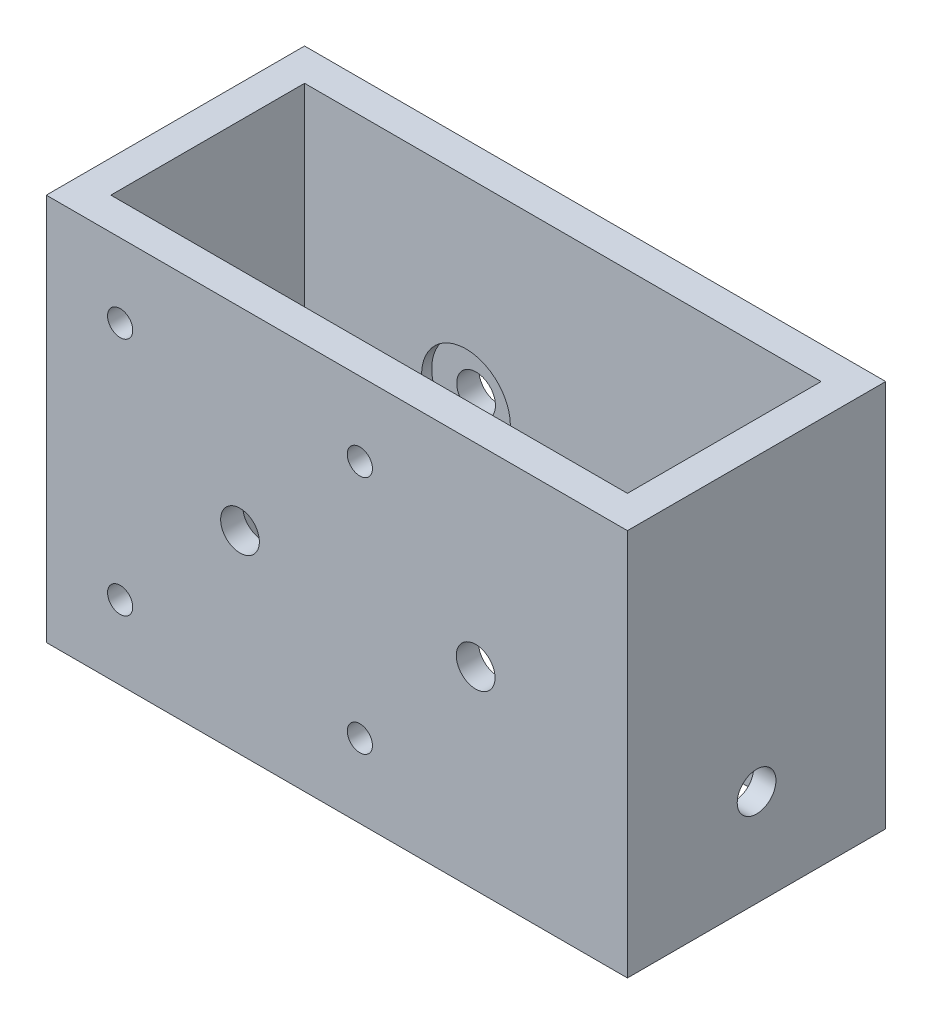
ISO-10303-21;
HEADER;
FILE_DESCRIPTION(('STEP AP214'),'2;1');
FILE_NAME('part.step','',(''),(''),'','','');
FILE_SCHEMA(('AUTOMOTIVE_DESIGN { 1 0 10303 214 1 1 1 1 }'));
ENDSEC;
DATA;
#1=APPLICATION_CONTEXT('core data for automotive mechanical design processes');
#2=APPLICATION_PROTOCOL_DEFINITION('international standard','automotive_design',2000,#1);
#3=PRODUCT_CONTEXT('',#1,'mechanical');
#4=PRODUCT('Part','Part','',(#3));
#5=PRODUCT_RELATED_PRODUCT_CATEGORY('part','',(#4));
#6=PRODUCT_DEFINITION_FORMATION('','',#4);
#7=PRODUCT_DEFINITION_CONTEXT('part definition',#1,'design');
#8=PRODUCT_DEFINITION('design','',#6,#7);
#9=PRODUCT_DEFINITION_SHAPE('','',#8);
#10=(LENGTH_UNIT() NAMED_UNIT(*) SI_UNIT(.MILLI.,.METRE.));
#11=(NAMED_UNIT(*) PLANE_ANGLE_UNIT() SI_UNIT($,.RADIAN.));
#12=(NAMED_UNIT(*) SI_UNIT($,.STERADIAN.) SOLID_ANGLE_UNIT());
#13=UNCERTAINTY_MEASURE_WITH_UNIT(LENGTH_MEASURE(1.E-05),#10,'distance_accuracy_value','');
#14=(GEOMETRIC_REPRESENTATION_CONTEXT(3) GLOBAL_UNCERTAINTY_ASSIGNED_CONTEXT((#13)) GLOBAL_UNIT_ASSIGNED_CONTEXT((#10,
#11,#12)) REPRESENTATION_CONTEXT('',''));
#15=CARTESIAN_POINT('',(0.,0.,0.));
#16=DIRECTION('',(0.,0.,1.));
#17=DIRECTION('',(1.,0.,0.));
#18=AXIS2_PLACEMENT_3D('',#15,#16,#17);
#19=CARTESIAN_POINT('',(38.1,38.1,0.));
#20=DIRECTION('',(0.,0.,1.));
#21=DIRECTION('',(1.,0.,0.));
#22=AXIS2_PLACEMENT_3D('',#19,#20,#21);
#23=CYLINDRICAL_SURFACE('',#22,3.81);
#24=CARTESIAN_POINT('',(38.1,38.1,0.));
#25=DIRECTION('',(0.,0.,1.));
#26=DIRECTION('',(1.,0.,0.));
#27=AXIS2_PLACEMENT_3D('',#24,#25,#26);
#28=CIRCLE('',#27,3.81);
#29=CARTESIAN_POINT('',(41.91,38.1,0.));
#30=VERTEX_POINT('',#29);
#31=EDGE_CURVE('E233',#30,#30,#28,.T.);
#32=ORIENTED_EDGE('',*,*,#31,.F.);
#33=EDGE_LOOP('',(#32));
#34=FACE_BOUND('',#33,.T.);
#35=CARTESIAN_POINT('',(38.1,38.1,4.365625));
#36=DIRECTION('',(0.,0.,1.));
#37=DIRECTION('',(1.,0.,0.));
#38=AXIS2_PLACEMENT_3D('',#35,#36,#37);
#39=CIRCLE('',#38,3.81);
#40=CARTESIAN_POINT('',(41.91,38.1,4.365625));
#41=VERTEX_POINT('',#40);
#42=EDGE_CURVE('E38',#41,#41,#39,.F.);
#43=ORIENTED_EDGE('',*,*,#42,.F.);
#44=EDGE_LOOP('',(#43));
#45=FACE_BOUND('',#44,.T.);
#46=ADVANCED_FACE('F34',(#34,#45),#23,.F.);
#47=CARTESIAN_POINT('',(84.455,38.1,0.));
#48=DIRECTION('',(0.,0.,1.));
#49=DIRECTION('',(1.,0.,0.));
#50=AXIS2_PLACEMENT_3D('',#47,#48,#49);
#51=CYLINDRICAL_SURFACE('',#50,3.81);
#52=CARTESIAN_POINT('',(84.455,38.1,0.));
#53=DIRECTION('',(0.,0.,1.));
#54=DIRECTION('',(1.,0.,0.));
#55=AXIS2_PLACEMENT_3D('',#52,#53,#54);
#56=CIRCLE('',#55,3.81);
#57=CARTESIAN_POINT('',(88.265,38.1,0.));
#58=VERTEX_POINT('',#57);
#59=EDGE_CURVE('E227',#58,#58,#56,.T.);
#60=ORIENTED_EDGE('',*,*,#59,.F.);
#61=EDGE_LOOP('',(#60));
#62=FACE_BOUND('',#61,.T.);
#63=CARTESIAN_POINT('',(84.455,38.1,4.365625));
#64=DIRECTION('',(0.,0.,1.));
#65=DIRECTION('',(1.,0.,0.));
#66=AXIS2_PLACEMENT_3D('',#63,#64,#65);
#67=CIRCLE('',#66,3.81);
#68=CARTESIAN_POINT('',(88.265,38.1,4.365625));
#69=VERTEX_POINT('',#68);
#70=EDGE_CURVE('E182',#69,#69,#67,.F.);
#71=ORIENTED_EDGE('',*,*,#70,.F.);
#72=EDGE_LOOP('',(#71));
#73=FACE_BOUND('',#72,.T.);
#74=ADVANCED_FACE('F300',(#62,#73),#51,.F.);
#75=CARTESIAN_POINT('',(114.3,19.05,25.4));
#76=DIRECTION('',(-1.,0.,0.));
#77=DIRECTION('',(0.,0.,1.));
#78=AXIS2_PLACEMENT_3D('',#75,#76,#77);
#79=CYLINDRICAL_SURFACE('',#78,3.81);
#80=CARTESIAN_POINT('',(114.3,19.05,25.4));
#81=DIRECTION('',(-1.,0.,0.));
#82=DIRECTION('',(0.,0.,1.));
#83=AXIS2_PLACEMENT_3D('',#80,#81,#82);
#84=CIRCLE('',#83,3.81);
#85=CARTESIAN_POINT('',(114.3,19.05,29.21));
#86=VERTEX_POINT('',#85);
#87=EDGE_CURVE('E221',#86,#86,#84,.T.);
#88=ORIENTED_EDGE('',*,*,#87,.F.);
#89=EDGE_LOOP('',(#88));
#90=FACE_BOUND('',#89,.T.);
#91=CARTESIAN_POINT('',(109.934375,19.05,25.4));
#92=DIRECTION('',(-1.,0.,0.));
#93=DIRECTION('',(0.,0.,1.));
#94=AXIS2_PLACEMENT_3D('',#91,#92,#93);
#95=CIRCLE('',#94,3.81);
#96=CARTESIAN_POINT('',(109.934375,19.05,29.21));
#97=VERTEX_POINT('',#96);
#98=EDGE_CURVE('E178',#97,#97,#95,.F.);
#99=ORIENTED_EDGE('',*,*,#98,.F.);
#100=EDGE_LOOP('',(#99));
#101=FACE_BOUND('',#100,.T.);
#102=ADVANCED_FACE('F297',(#90,#101),#79,.F.);
#103=CARTESIAN_POINT('',(38.1,38.1,50.8));
#104=DIRECTION('',(0.,0.,1.));
#105=DIRECTION('',(1.,0.,0.));
#106=AXIS2_PLACEMENT_3D('',#103,#104,#105);
#107=CIRCLE('',#106,3.81);
#108=CARTESIAN_POINT('',(41.91,38.1,50.8));
#109=VERTEX_POINT('',#108);
#110=EDGE_CURVE('E230',#109,#109,#107,.T.);
#111=ORIENTED_EDGE('',*,*,#110,.T.);
#112=EDGE_LOOP('',(#111));
#113=FACE_BOUND('',#112,.T.);
#114=CARTESIAN_POINT('',(38.1,38.1,46.434375));
#115=DIRECTION('',(0.,0.,-1.));
#116=DIRECTION('',(-1.,0.,0.));
#117=AXIS2_PLACEMENT_3D('',#114,#115,#116);
#118=CIRCLE('',#117,3.81);
#119=CARTESIAN_POINT('',(34.29,38.1,46.434375));
#120=VERTEX_POINT('',#119);
#121=EDGE_CURVE('E173',#120,#120,#118,.F.);
#122=ORIENTED_EDGE('',*,*,#121,.F.);
#123=EDGE_LOOP('',(#122));
#124=FACE_BOUND('',#123,.T.);
#125=ADVANCED_FACE('F303',(#113,#124),#23,.F.);
#126=CARTESIAN_POINT('',(84.455,38.1,50.8));
#127=DIRECTION('',(0.,0.,1.));
#128=DIRECTION('',(1.,0.,0.));
#129=AXIS2_PLACEMENT_3D('',#126,#127,#128);
#130=CIRCLE('',#129,3.81);
#131=CARTESIAN_POINT('',(88.265,38.1,50.8));
#132=VERTEX_POINT('',#131);
#133=EDGE_CURVE('E224',#132,#132,#130,.T.);
#134=ORIENTED_EDGE('',*,*,#133,.T.);
#135=EDGE_LOOP('',(#134));
#136=FACE_BOUND('',#135,.T.);
#137=CARTESIAN_POINT('',(84.455,38.1,46.434375));
#138=DIRECTION('',(0.,0.,-1.));
#139=DIRECTION('',(-1.,0.,0.));
#140=AXIS2_PLACEMENT_3D('',#137,#138,#139);
#141=CIRCLE('',#140,3.81);
#142=CARTESIAN_POINT('',(80.645,38.1,46.434375));
#143=VERTEX_POINT('',#142);
#144=EDGE_CURVE('E170',#143,#143,#141,.F.);
#145=ORIENTED_EDGE('',*,*,#144,.F.);
#146=EDGE_LOOP('',(#145));
#147=FACE_BOUND('',#146,.T.);
#148=ADVANCED_FACE('F294',(#136,#147),#51,.F.);
#149=CARTESIAN_POINT('',(0.,19.05,25.4));
#150=DIRECTION('',(-1.,0.,0.));
#151=DIRECTION('',(0.,0.,1.));
#152=AXIS2_PLACEMENT_3D('',#149,#150,#151);
#153=CIRCLE('',#152,3.81);
#154=CARTESIAN_POINT('',(0.,19.05,29.21));
#155=VERTEX_POINT('',#154);
#156=EDGE_CURVE('E168',#155,#155,#153,.T.);
#157=ORIENTED_EDGE('',*,*,#156,.T.);
#158=EDGE_LOOP('',(#157));
#159=FACE_BOUND('',#158,.T.);
#160=CARTESIAN_POINT('',(4.365625,19.05,25.4));
#161=DIRECTION('',(1.,0.,0.));
#162=DIRECTION('',(0.,0.,-1.));
#163=AXIS2_PLACEMENT_3D('',#160,#161,#162);
#164=CIRCLE('',#163,3.81);
#165=CARTESIAN_POINT('',(4.365625,19.05,21.59));
#166=VERTEX_POINT('',#165);
#167=EDGE_CURVE('E165',#166,#166,#164,.F.);
#168=ORIENTED_EDGE('',*,*,#167,.F.);
#169=EDGE_LOOP('',(#168));
#170=FACE_BOUND('',#169,.T.);
#171=ADVANCED_FACE('F287',(#159,#170),#79,.F.);
#172=CARTESIAN_POINT('',(0.,76.2,0.));
#173=DIRECTION('',(0.,1.,0.));
#174=DIRECTION('',(0.,0.,1.));
#175=AXIS2_PLACEMENT_3D('',#172,#173,#174);
#176=PLANE('',#175);
#177=DIRECTION('',(0.,0.,1.));
#178=VECTOR('',#177,1.);
#179=CARTESIAN_POINT('',(0.,76.2,0.));
#180=LINE('',#179,#178);
#181=CARTESIAN_POINT('',(0.,76.2,0.));
#182=VERTEX_POINT('',#181);
#183=CARTESIAN_POINT('',(0.,76.2,50.8));
#184=VERTEX_POINT('',#183);
#185=EDGE_CURVE('E140',#182,#184,#180,.T.);
#186=ORIENTED_EDGE('',*,*,#185,.T.);
#187=DIRECTION('',(1.,0.,0.));
#188=VECTOR('',#187,1.);
#189=CARTESIAN_POINT('',(0.,76.2,50.8));
#190=LINE('',#189,#188);
#191=CARTESIAN_POINT('',(114.3,76.2,50.8));
#192=VERTEX_POINT('',#191);
#193=EDGE_CURVE('E143',#184,#192,#190,.T.);
#194=ORIENTED_EDGE('',*,*,#193,.T.);
#195=DIRECTION('',(0.,0.,-1.));
#196=VECTOR('',#195,1.);
#197=CARTESIAN_POINT('',(114.3,76.2,0.));
#198=LINE('',#197,#196);
#199=CARTESIAN_POINT('',(114.3,76.2,0.));
#200=VERTEX_POINT('',#199);
#201=EDGE_CURVE('E146',#192,#200,#198,.T.);
#202=ORIENTED_EDGE('',*,*,#201,.T.);
#203=DIRECTION('',(-1.,0.,0.));
#204=VECTOR('',#203,1.);
#205=CARTESIAN_POINT('',(0.,76.2,0.));
#206=LINE('',#205,#204);
#207=EDGE_CURVE('E148',#200,#182,#206,.T.);
#208=ORIENTED_EDGE('',*,*,#207,.T.);
#209=EDGE_LOOP('',(#186,#194,#202,#208));
#210=FACE_BOUND('',#209,.T.);
#211=DIRECTION('',(1.,0.,0.));
#212=VECTOR('',#211,1.);
#213=CARTESIAN_POINT('',(107.95,76.2,44.45));
#214=LINE('',#213,#212);
#215=CARTESIAN_POINT('',(6.35,76.2,44.45));
#216=VERTEX_POINT('',#215);
#217=CARTESIAN_POINT('',(107.95,76.2,44.45));
#218=VERTEX_POINT('',#217);
#219=EDGE_CURVE('E109',#216,#218,#214,.T.);
#220=ORIENTED_EDGE('',*,*,#219,.F.);
#221=DIRECTION('',(0.,0.,1.));
#222=VECTOR('',#221,1.);
#223=CARTESIAN_POINT('',(6.35,76.2,44.45));
#224=LINE('',#223,#222);
#225=CARTESIAN_POINT('',(6.35,76.2,6.35));
#226=VERTEX_POINT('',#225);
#227=EDGE_CURVE('E101',#226,#216,#224,.T.);
#228=ORIENTED_EDGE('',*,*,#227,.F.);
#229=DIRECTION('',(-1.,0.,0.));
#230=VECTOR('',#229,1.);
#231=CARTESIAN_POINT('',(107.95,76.2,6.35));
#232=LINE('',#231,#230);
#233=CARTESIAN_POINT('',(107.95,76.2,6.35));
#234=VERTEX_POINT('',#233);
#235=EDGE_CURVE('E124',#234,#226,#232,.T.);
#236=ORIENTED_EDGE('',*,*,#235,.F.);
#237=DIRECTION('',(0.,0.,-1.));
#238=VECTOR('',#237,1.);
#239=CARTESIAN_POINT('',(107.95,76.2,44.45));
#240=LINE('',#239,#238);
#241=EDGE_CURVE('E122',#218,#234,#240,.T.);
#242=ORIENTED_EDGE('',*,*,#241,.F.);
#243=EDGE_LOOP('',(#220,#228,#236,#242));
#244=FACE_BOUND('',#243,.T.);
#245=ADVANCED_FACE('F121',(#210,#244),#176,.T.);
#246=CARTESIAN_POINT('',(0.,0.,0.));
#247=DIRECTION('',(0.,1.,0.));
#248=DIRECTION('',(0.,0.,1.));
#249=AXIS2_PLACEMENT_3D('',#246,#247,#248);
#250=PLANE('',#249);
#251=DIRECTION('',(0.,0.,1.));
#252=VECTOR('',#251,1.);
#253=CARTESIAN_POINT('',(0.,0.,0.));
#254=LINE('',#253,#252);
#255=CARTESIAN_POINT('',(0.,0.,0.));
#256=VERTEX_POINT('',#255);
#257=CARTESIAN_POINT('',(0.,0.,50.8));
#258=VERTEX_POINT('',#257);
#259=EDGE_CURVE('E117',#256,#258,#254,.T.);
#260=ORIENTED_EDGE('',*,*,#259,.F.);
#261=DIRECTION('',(-1.,0.,0.));
#262=VECTOR('',#261,1.);
#263=CARTESIAN_POINT('',(0.,0.,0.));
#264=LINE('',#263,#262);
#265=CARTESIAN_POINT('',(114.3,0.,0.));
#266=VERTEX_POINT('',#265);
#267=EDGE_CURVE('E144',#266,#256,#264,.T.);
#268=ORIENTED_EDGE('',*,*,#267,.F.);
#269=DIRECTION('',(0.,0.,-1.));
#270=VECTOR('',#269,1.);
#271=CARTESIAN_POINT('',(114.3,0.,0.));
#272=LINE('',#271,#270);
#273=CARTESIAN_POINT('',(114.3,0.,50.8));
#274=VERTEX_POINT('',#273);
#275=EDGE_CURVE('E155',#274,#266,#272,.T.);
#276=ORIENTED_EDGE('',*,*,#275,.F.);
#277=DIRECTION('',(1.,0.,0.));
#278=VECTOR('',#277,1.);
#279=CARTESIAN_POINT('',(0.,0.,50.8));
#280=LINE('',#279,#278);
#281=EDGE_CURVE('E153',#258,#274,#280,.T.);
#282=ORIENTED_EDGE('',*,*,#281,.F.);
#283=EDGE_LOOP('',(#260,#268,#276,#282));
#284=FACE_BOUND('',#283,.T.);
#285=DIRECTION('',(0.,0.,1.));
#286=VECTOR('',#285,1.);
#287=CARTESIAN_POINT('',(6.35,0.,44.45));
#288=LINE('',#287,#286);
#289=CARTESIAN_POINT('',(6.35,0.,6.35));
#290=VERTEX_POINT('',#289);
#291=CARTESIAN_POINT('',(6.35,0.,44.45));
#292=VERTEX_POINT('',#291);
#293=EDGE_CURVE('E59',#290,#292,#288,.T.);
#294=ORIENTED_EDGE('',*,*,#293,.T.);
#295=DIRECTION('',(1.,0.,0.));
#296=VECTOR('',#295,1.);
#297=CARTESIAN_POINT('',(107.95,0.,44.45));
#298=LINE('',#297,#296);
#299=CARTESIAN_POINT('',(107.95,0.,44.45));
#300=VERTEX_POINT('',#299);
#301=EDGE_CURVE('E116',#292,#300,#298,.T.);
#302=ORIENTED_EDGE('',*,*,#301,.T.);
#303=DIRECTION('',(0.,0.,-1.));
#304=VECTOR('',#303,1.);
#305=CARTESIAN_POINT('',(107.95,0.,44.45));
#306=LINE('',#305,#304);
#307=CARTESIAN_POINT('',(107.95,0.,6.35));
#308=VERTEX_POINT('',#307);
#309=EDGE_CURVE('E132',#300,#308,#306,.T.);
#310=ORIENTED_EDGE('',*,*,#309,.T.);
#311=DIRECTION('',(-1.,0.,0.));
#312=VECTOR('',#311,1.);
#313=CARTESIAN_POINT('',(107.95,0.,6.35));
#314=LINE('',#313,#312);
#315=EDGE_CURVE('E110',#308,#290,#314,.T.);
#316=ORIENTED_EDGE('',*,*,#315,.T.);
#317=EDGE_LOOP('',(#294,#302,#310,#316));
#318=FACE_BOUND('',#317,.T.);
#319=ADVANCED_FACE('F277',(#284,#318),#250,.F.);
#320=CARTESIAN_POINT('',(0.,76.2,0.));
#321=DIRECTION('',(1.,0.,0.));
#322=DIRECTION('',(0.,0.,-1.));
#323=AXIS2_PLACEMENT_3D('',#320,#321,#322);
#324=PLANE('',#323);
#325=ORIENTED_EDGE('',*,*,#156,.F.);
#326=EDGE_LOOP('',(#325));
#327=FACE_BOUND('',#326,.T.);
#328=ORIENTED_EDGE('',*,*,#259,.T.);
#329=DIRECTION('',(0.,-1.,0.));
#330=VECTOR('',#329,1.);
#331=CARTESIAN_POINT('',(0.,76.2,50.8));
#332=LINE('',#331,#330);
#333=EDGE_CURVE('E11',#184,#258,#332,.T.);
#334=ORIENTED_EDGE('',*,*,#333,.F.);
#335=ORIENTED_EDGE('',*,*,#185,.F.);
#336=DIRECTION('',(0.,-1.,0.));
#337=VECTOR('',#336,1.);
#338=CARTESIAN_POINT('',(0.,76.2,0.));
#339=LINE('',#338,#337);
#340=EDGE_CURVE('E150',#182,#256,#339,.T.);
#341=ORIENTED_EDGE('',*,*,#340,.T.);
#342=EDGE_LOOP('',(#328,#334,#335,#341));
#343=FACE_BOUND('',#342,.T.);
#344=ADVANCED_FACE('F36',(#327,#343),#324,.F.);
#345=CARTESIAN_POINT('',(0.,76.2,50.8));
#346=DIRECTION('',(0.,0.,-1.));
#347=DIRECTION('',(-1.,0.,0.));
#348=AXIS2_PLACEMENT_3D('',#345,#346,#347);
#349=PLANE('',#348);
#350=ORIENTED_EDGE('',*,*,#133,.F.);
#351=EDGE_LOOP('',(#350));
#352=FACE_BOUND('',#351,.T.);
#353=ORIENTED_EDGE('',*,*,#110,.F.);
#354=EDGE_LOOP('',(#353));
#355=FACE_BOUND('',#354,.T.);
#356=CARTESIAN_POINT('',(14.5268276821935,14.5268276821935,50.8));
#357=DIRECTION('',(0.,0.,1.));
#358=DIRECTION('',(1.,0.,0.));
#359=AXIS2_PLACEMENT_3D('',#356,#357,#358);
#360=CIRCLE('',#359,2.4765);
#361=CARTESIAN_POINT('',(17.0033276821935,14.5268276821935,50.8));
#362=VERTEX_POINT('',#361);
#363=EDGE_CURVE('E236',#362,#362,#360,.T.);
#364=ORIENTED_EDGE('',*,*,#363,.F.);
#365=EDGE_LOOP('',(#364));
#366=FACE_BOUND('',#365,.T.);
#367=CARTESIAN_POINT('',(61.6731723178065,14.5268276821935,50.8));
#368=DIRECTION('',(0.,0.,1.));
#369=DIRECTION('',(1.,0.,0.));
#370=AXIS2_PLACEMENT_3D('',#367,#368,#369);
#371=CIRCLE('',#370,2.4765);
#372=CARTESIAN_POINT('',(64.1496723178065,14.5268276821935,50.8));
#373=VERTEX_POINT('',#372);
#374=EDGE_CURVE('E247',#373,#373,#371,.T.);
#375=ORIENTED_EDGE('',*,*,#374,.F.);
#376=EDGE_LOOP('',(#375));
#377=FACE_BOUND('',#376,.T.);
#378=CARTESIAN_POINT('',(61.6731723178065,61.6731723178065,50.8));
#379=DIRECTION('',(0.,0.,1.));
#380=DIRECTION('',(1.,0.,0.));
#381=AXIS2_PLACEMENT_3D('',#378,#379,#380);
#382=CIRCLE('',#381,2.4765);
#383=CARTESIAN_POINT('',(64.1496723178065,61.6731723178065,50.8));
#384=VERTEX_POINT('',#383);
#385=EDGE_CURVE('E239',#384,#384,#382,.T.);
#386=ORIENTED_EDGE('',*,*,#385,.F.);
#387=EDGE_LOOP('',(#386));
#388=FACE_BOUND('',#387,.T.);
#389=CARTESIAN_POINT('',(14.5268276821935,61.6731723178065,50.8));
#390=DIRECTION('',(0.,0.,1.));
#391=DIRECTION('',(1.,0.,0.));
#392=AXIS2_PLACEMENT_3D('',#389,#390,#391);
#393=CIRCLE('',#392,2.47649999999999);
#394=CARTESIAN_POINT('',(17.0033276821935,61.6731723178065,50.8));
#395=VERTEX_POINT('',#394);
#396=EDGE_CURVE('E130',#395,#395,#393,.T.);
#397=ORIENTED_EDGE('',*,*,#396,.F.);
#398=EDGE_LOOP('',(#397));
#399=FACE_BOUND('',#398,.T.);
#400=ORIENTED_EDGE('',*,*,#281,.T.);
#401=DIRECTION('',(0.,-1.,0.));
#402=VECTOR('',#401,1.);
#403=CARTESIAN_POINT('',(114.3,76.2,50.8));
#404=LINE('',#403,#402);
#405=EDGE_CURVE('E43',#192,#274,#404,.T.);
#406=ORIENTED_EDGE('',*,*,#405,.F.);
#407=ORIENTED_EDGE('',*,*,#193,.F.);
#408=ORIENTED_EDGE('',*,*,#333,.T.);
#409=EDGE_LOOP('',(#400,#406,#407,#408));
#410=FACE_BOUND('',#409,.T.);
#411=ADVANCED_FACE('F263',(#352,#355,#366,#377,#388,#399,#410),#349,.F.);
#412=CARTESIAN_POINT('',(114.3,76.2,0.));
#413=DIRECTION('',(-1.,0.,0.));
#414=DIRECTION('',(0.,0.,1.));
#415=AXIS2_PLACEMENT_3D('',#412,#413,#414);
#416=PLANE('',#415);
#417=ORIENTED_EDGE('',*,*,#87,.T.);
#418=EDGE_LOOP('',(#417));
#419=FACE_BOUND('',#418,.T.);
#420=ORIENTED_EDGE('',*,*,#275,.T.);
#421=DIRECTION('',(0.,-1.,0.));
#422=VECTOR('',#421,1.);
#423=CARTESIAN_POINT('',(114.3,76.2,0.));
#424=LINE('',#423,#422);
#425=EDGE_CURVE('E160',#200,#266,#424,.T.);
#426=ORIENTED_EDGE('',*,*,#425,.F.);
#427=ORIENTED_EDGE('',*,*,#201,.F.);
#428=ORIENTED_EDGE('',*,*,#405,.T.);
#429=EDGE_LOOP('',(#420,#426,#427,#428));
#430=FACE_BOUND('',#429,.T.);
#431=ADVANCED_FACE('F266',(#419,#430),#416,.F.);
#432=CARTESIAN_POINT('',(0.,76.2,0.));
#433=DIRECTION('',(0.,0.,1.));
#434=DIRECTION('',(1.,0.,0.));
#435=AXIS2_PLACEMENT_3D('',#432,#433,#434);
#436=PLANE('',#435);
#437=ORIENTED_EDGE('',*,*,#59,.T.);
#438=EDGE_LOOP('',(#437));
#439=FACE_BOUND('',#438,.T.);
#440=ORIENTED_EDGE('',*,*,#31,.T.);
#441=EDGE_LOOP('',(#440));
#442=FACE_BOUND('',#441,.T.);
#443=ORIENTED_EDGE('',*,*,#267,.T.);
#444=ORIENTED_EDGE('',*,*,#340,.F.);
#445=ORIENTED_EDGE('',*,*,#207,.F.);
#446=ORIENTED_EDGE('',*,*,#425,.T.);
#447=EDGE_LOOP('',(#443,#444,#445,#446));
#448=FACE_BOUND('',#447,.T.);
#449=ADVANCED_FACE('F281',(#439,#442,#448),#436,.F.);
#450=CARTESIAN_POINT('',(6.35,76.2,44.45));
#451=DIRECTION('',(1.,0.,0.));
#452=DIRECTION('',(0.,0.,-1.));
#453=AXIS2_PLACEMENT_3D('',#450,#451,#452);
#454=PLANE('',#453);
#455=CARTESIAN_POINT('',(6.35,19.05,25.4));
#456=DIRECTION('',(1.,0.,0.));
#457=DIRECTION('',(0.,0.,-1.));
#458=AXIS2_PLACEMENT_3D('',#455,#456,#457);
#459=CIRCLE('',#458,8.73125);
#460=CARTESIAN_POINT('',(6.35,19.05,16.66875));
#461=VERTEX_POINT('',#460);
#462=EDGE_CURVE('E177',#461,#461,#459,.T.);
#463=ORIENTED_EDGE('',*,*,#462,.F.);
#464=EDGE_LOOP('',(#463));
#465=FACE_BOUND('',#464,.T.);
#466=ORIENTED_EDGE('',*,*,#293,.F.);
#467=DIRECTION('',(0.,-1.,0.));
#468=VECTOR('',#467,1.);
#469=CARTESIAN_POINT('',(6.35,76.2,6.35));
#470=LINE('',#469,#468);
#471=EDGE_CURVE('E105',#226,#290,#470,.T.);
#472=ORIENTED_EDGE('',*,*,#471,.F.);
#473=ORIENTED_EDGE('',*,*,#227,.T.);
#474=DIRECTION('',(0.,-1.,0.));
#475=VECTOR('',#474,1.);
#476=CARTESIAN_POINT('',(6.35,76.2,44.45));
#477=LINE('',#476,#475);
#478=EDGE_CURVE('E104',#216,#292,#477,.T.);
#479=ORIENTED_EDGE('',*,*,#478,.T.);
#480=EDGE_LOOP('',(#466,#472,#473,#479));
#481=FACE_BOUND('',#480,.T.);
#482=ADVANCED_FACE('F103',(#465,#481),#454,.T.);
#483=CARTESIAN_POINT('',(107.95,76.2,44.45));
#484=DIRECTION('',(0.,0.,-1.));
#485=DIRECTION('',(-1.,0.,0.));
#486=AXIS2_PLACEMENT_3D('',#483,#484,#485);
#487=PLANE('',#486);
#488=CARTESIAN_POINT('',(38.1,38.1,44.45));
#489=DIRECTION('',(0.,0.,-1.));
#490=DIRECTION('',(-1.,0.,0.));
#491=AXIS2_PLACEMENT_3D('',#488,#489,#490);
#492=CIRCLE('',#491,8.73125);
#493=CARTESIAN_POINT('',(29.36875,38.1,44.45));
#494=VERTEX_POINT('',#493);
#495=EDGE_CURVE('E209',#494,#494,#492,.T.);
#496=ORIENTED_EDGE('',*,*,#495,.F.);
#497=EDGE_LOOP('',(#496));
#498=FACE_BOUND('',#497,.T.);
#499=CARTESIAN_POINT('',(84.455,38.1,44.45));
#500=DIRECTION('',(0.,0.,-1.));
#501=DIRECTION('',(-1.,0.,0.));
#502=AXIS2_PLACEMENT_3D('',#499,#500,#501);
#503=CIRCLE('',#502,8.73125);
#504=CARTESIAN_POINT('',(75.72375,38.1,44.45));
#505=VERTEX_POINT('',#504);
#506=EDGE_CURVE('E180',#505,#505,#503,.T.);
#507=ORIENTED_EDGE('',*,*,#506,.F.);
#508=EDGE_LOOP('',(#507));
#509=FACE_BOUND('',#508,.T.);
#510=CARTESIAN_POINT('',(14.5268276821935,14.5268276821935,44.45));
#511=DIRECTION('',(0.,0.,-1.));
#512=DIRECTION('',(-1.,0.,0.));
#513=AXIS2_PLACEMENT_3D('',#510,#511,#512);
#514=CIRCLE('',#513,2.4765);
#515=CARTESIAN_POINT('',(12.0503276821935,14.5268276821935,44.45));
#516=VERTEX_POINT('',#515);
#517=EDGE_CURVE('E250',#516,#516,#514,.F.);
#518=ORIENTED_EDGE('',*,*,#517,.T.);
#519=EDGE_LOOP('',(#518));
#520=FACE_BOUND('',#519,.T.);
#521=CARTESIAN_POINT('',(61.6731723178065,14.5268276821935,44.45));
#522=DIRECTION('',(0.,0.,-1.));
#523=DIRECTION('',(-1.,0.,0.));
#524=AXIS2_PLACEMENT_3D('',#521,#522,#523);
#525=CIRCLE('',#524,2.4765);
#526=CARTESIAN_POINT('',(59.1966723178065,14.5268276821935,44.45));
#527=VERTEX_POINT('',#526);
#528=EDGE_CURVE('E243',#527,#527,#525,.F.);
#529=ORIENTED_EDGE('',*,*,#528,.T.);
#530=EDGE_LOOP('',(#529));
#531=FACE_BOUND('',#530,.T.);
#532=CARTESIAN_POINT('',(61.6731723178065,61.6731723178065,44.45));
#533=DIRECTION('',(0.,0.,-1.));
#534=DIRECTION('',(-1.,0.,0.));
#535=AXIS2_PLACEMENT_3D('',#532,#533,#534);
#536=CIRCLE('',#535,2.4765);
#537=CARTESIAN_POINT('',(59.1966723178065,61.6731723178065,44.45));
#538=VERTEX_POINT('',#537);
#539=EDGE_CURVE('E242',#538,#538,#536,.F.);
#540=ORIENTED_EDGE('',*,*,#539,.T.);
#541=EDGE_LOOP('',(#540));
#542=FACE_BOUND('',#541,.T.);
#543=CARTESIAN_POINT('',(14.5268276821935,61.6731723178065,44.45));
#544=DIRECTION('',(0.,0.,-1.));
#545=DIRECTION('',(-1.,0.,0.));
#546=AXIS2_PLACEMENT_3D('',#543,#544,#545);
#547=CIRCLE('',#546,2.47649999999999);
#548=CARTESIAN_POINT('',(12.0503276821935,61.6731723178065,44.45));
#549=VERTEX_POINT('',#548);
#550=EDGE_CURVE('E246',#549,#549,#547,.F.);
#551=ORIENTED_EDGE('',*,*,#550,.T.);
#552=EDGE_LOOP('',(#551));
#553=FACE_BOUND('',#552,.T.);
#554=ORIENTED_EDGE('',*,*,#301,.F.);
#555=ORIENTED_EDGE('',*,*,#478,.F.);
#556=ORIENTED_EDGE('',*,*,#219,.T.);
#557=DIRECTION('',(0.,-1.,0.));
#558=VECTOR('',#557,1.);
#559=CARTESIAN_POINT('',(107.95,76.2,44.45));
#560=LINE('',#559,#558);
#561=EDGE_CURVE('E118',#218,#300,#560,.T.);
#562=ORIENTED_EDGE('',*,*,#561,.T.);
#563=EDGE_LOOP('',(#554,#555,#556,#562));
#564=FACE_BOUND('',#563,.T.);
#565=ADVANCED_FACE('F113',(#498,#509,#520,#531,#542,#553,#564),#487,.T.);
#566=CARTESIAN_POINT('',(107.95,76.2,44.45));
#567=DIRECTION('',(-1.,0.,0.));
#568=DIRECTION('',(0.,0.,1.));
#569=AXIS2_PLACEMENT_3D('',#566,#567,#568);
#570=PLANE('',#569);
#571=CARTESIAN_POINT('',(107.95,19.05,25.4));
#572=DIRECTION('',(-1.,0.,0.));
#573=DIRECTION('',(0.,0.,1.));
#574=AXIS2_PLACEMENT_3D('',#571,#572,#573);
#575=CIRCLE('',#574,8.73125);
#576=CARTESIAN_POINT('',(107.95,19.05,34.13125));
#577=VERTEX_POINT('',#576);
#578=EDGE_CURVE('E188',#577,#577,#575,.T.);
#579=ORIENTED_EDGE('',*,*,#578,.F.);
#580=EDGE_LOOP('',(#579));
#581=FACE_BOUND('',#580,.T.);
#582=ORIENTED_EDGE('',*,*,#309,.F.);
#583=ORIENTED_EDGE('',*,*,#561,.F.);
#584=ORIENTED_EDGE('',*,*,#241,.T.);
#585=DIRECTION('',(0.,-1.,0.));
#586=VECTOR('',#585,1.);
#587=CARTESIAN_POINT('',(107.95,76.2,6.35));
#588=LINE('',#587,#586);
#589=EDGE_CURVE('E51',#234,#308,#588,.T.);
#590=ORIENTED_EDGE('',*,*,#589,.T.);
#591=EDGE_LOOP('',(#582,#583,#584,#590));
#592=FACE_BOUND('',#591,.T.);
#593=ADVANCED_FACE('F366',(#581,#592),#570,.T.);
#594=CARTESIAN_POINT('',(107.95,76.2,6.35));
#595=DIRECTION('',(0.,0.,1.));
#596=DIRECTION('',(1.,0.,0.));
#597=AXIS2_PLACEMENT_3D('',#594,#595,#596);
#598=PLANE('',#597);
#599=CARTESIAN_POINT('',(38.1,38.1,6.35));
#600=DIRECTION('',(0.,0.,1.));
#601=DIRECTION('',(1.,0.,0.));
#602=AXIS2_PLACEMENT_3D('',#599,#600,#601);
#603=CIRCLE('',#602,8.73124999999999);
#604=CARTESIAN_POINT('',(46.83125,38.1,6.35));
#605=VERTEX_POINT('',#604);
#606=EDGE_CURVE('E190',#605,#605,#603,.T.);
#607=ORIENTED_EDGE('',*,*,#606,.F.);
#608=EDGE_LOOP('',(#607));
#609=FACE_BOUND('',#608,.T.);
#610=CARTESIAN_POINT('',(84.455,38.1,6.35));
#611=DIRECTION('',(0.,0.,1.));
#612=DIRECTION('',(1.,0.,0.));
#613=AXIS2_PLACEMENT_3D('',#610,#611,#612);
#614=CIRCLE('',#613,8.73125);
#615=CARTESIAN_POINT('',(93.18625,38.1,6.35));
#616=VERTEX_POINT('',#615);
#617=EDGE_CURVE('E200',#616,#616,#614,.T.);
#618=ORIENTED_EDGE('',*,*,#617,.F.);
#619=EDGE_LOOP('',(#618));
#620=FACE_BOUND('',#619,.T.);
#621=ORIENTED_EDGE('',*,*,#315,.F.);
#622=ORIENTED_EDGE('',*,*,#589,.F.);
#623=ORIENTED_EDGE('',*,*,#235,.T.);
#624=ORIENTED_EDGE('',*,*,#471,.T.);
#625=EDGE_LOOP('',(#621,#622,#623,#624));
#626=FACE_BOUND('',#625,.T.);
#627=ADVANCED_FACE('F374',(#609,#620,#626),#598,.T.);
#628=CARTESIAN_POINT('',(14.5268276821935,61.6731723178065,-0.001000000000001));
#629=DIRECTION('',(0.,0.,1.));
#630=DIRECTION('',(1.,0.,0.));
#631=AXIS2_PLACEMENT_3D('',#628,#629,#630);
#632=CYLINDRICAL_SURFACE('',#631,2.47649999999999);
#633=ORIENTED_EDGE('',*,*,#550,.F.);
#634=EDGE_LOOP('',(#633));
#635=FACE_BOUND('',#634,.T.);
#636=ORIENTED_EDGE('',*,*,#396,.T.);
#637=EDGE_LOOP('',(#636));
#638=FACE_BOUND('',#637,.T.);
#639=ADVANCED_FACE('F261',(#635,#638),#632,.F.);
#640=CARTESIAN_POINT('',(61.6731723178065,61.6731723178065,-0.001000000000001));
#641=DIRECTION('',(0.,0.,1.));
#642=DIRECTION('',(1.,0.,0.));
#643=AXIS2_PLACEMENT_3D('',#640,#641,#642);
#644=CYLINDRICAL_SURFACE('',#643,2.4765);
#645=ORIENTED_EDGE('',*,*,#539,.F.);
#646=EDGE_LOOP('',(#645));
#647=FACE_BOUND('',#646,.T.);
#648=ORIENTED_EDGE('',*,*,#385,.T.);
#649=EDGE_LOOP('',(#648));
#650=FACE_BOUND('',#649,.T.);
#651=ADVANCED_FACE('F381',(#647,#650),#644,.F.);
#652=CARTESIAN_POINT('',(61.6731723178065,14.5268276821935,-0.001000000000001));
#653=DIRECTION('',(0.,0.,1.));
#654=DIRECTION('',(1.,0.,0.));
#655=AXIS2_PLACEMENT_3D('',#652,#653,#654);
#656=CYLINDRICAL_SURFACE('',#655,2.4765);
#657=ORIENTED_EDGE('',*,*,#528,.F.);
#658=EDGE_LOOP('',(#657));
#659=FACE_BOUND('',#658,.T.);
#660=ORIENTED_EDGE('',*,*,#374,.T.);
#661=EDGE_LOOP('',(#660));
#662=FACE_BOUND('',#661,.T.);
#663=ADVANCED_FACE('F385',(#659,#662),#656,.F.);
#664=CARTESIAN_POINT('',(14.5268276821935,14.5268276821935,-0.001000000000001));
#665=DIRECTION('',(0.,0.,1.));
#666=DIRECTION('',(1.,0.,0.));
#667=AXIS2_PLACEMENT_3D('',#664,#665,#666);
#668=CYLINDRICAL_SURFACE('',#667,2.4765);
#669=ORIENTED_EDGE('',*,*,#517,.F.);
#670=EDGE_LOOP('',(#669));
#671=FACE_BOUND('',#670,.T.);
#672=ORIENTED_EDGE('',*,*,#363,.T.);
#673=EDGE_LOOP('',(#672));
#674=FACE_BOUND('',#673,.T.);
#675=ADVANCED_FACE('F351',(#671,#674),#668,.F.);
#676=CARTESIAN_POINT('',(4.365625,19.05,25.4));
#677=DIRECTION('',(1.,0.,0.));
#678=DIRECTION('',(0.,0.,-1.));
#679=AXIS2_PLACEMENT_3D('',#676,#677,#678);
#680=PLANE('',#679);
#681=CARTESIAN_POINT('',(4.365625,19.05,25.4));
#682=DIRECTION('',(1.,0.,0.));
#683=DIRECTION('',(0.,0.,-1.));
#684=AXIS2_PLACEMENT_3D('',#681,#682,#683);
#685=CIRCLE('',#684,8.73125);
#686=CARTESIAN_POINT('',(4.365625,19.05,16.66875));
#687=VERTEX_POINT('',#686);
#688=EDGE_CURVE('E169',#687,#687,#685,.T.);
#689=ORIENTED_EDGE('',*,*,#688,.T.);
#690=EDGE_LOOP('',(#689));
#691=FACE_BOUND('',#690,.T.);
#692=ORIENTED_EDGE('',*,*,#167,.T.);
#693=EDGE_LOOP('',(#692));
#694=FACE_BOUND('',#693,.T.);
#695=ADVANCED_FACE('F348',(#691,#694),#680,.T.);
#696=CARTESIAN_POINT('',(4.365625,19.05,25.4));
#697=DIRECTION('',(1.,0.,0.));
#698=DIRECTION('',(0.,0.,-1.));
#699=AXIS2_PLACEMENT_3D('',#696,#697,#698);
#700=CYLINDRICAL_SURFACE('',#699,8.73125);
#701=ORIENTED_EDGE('',*,*,#688,.F.);
#702=EDGE_LOOP('',(#701));
#703=FACE_BOUND('',#702,.T.);
#704=ORIENTED_EDGE('',*,*,#462,.T.);
#705=EDGE_LOOP('',(#704));
#706=FACE_BOUND('',#705,.T.);
#707=ADVANCED_FACE('F345',(#703,#706),#700,.F.);
#708=CARTESIAN_POINT('',(84.455,38.1,46.434375));
#709=DIRECTION('',(0.,0.,-1.));
#710=DIRECTION('',(-1.,0.,0.));
#711=AXIS2_PLACEMENT_3D('',#708,#709,#710);
#712=PLANE('',#711);
#713=CARTESIAN_POINT('',(84.455,38.1,46.434375));
#714=DIRECTION('',(0.,0.,-1.));
#715=DIRECTION('',(-1.,0.,0.));
#716=AXIS2_PLACEMENT_3D('',#713,#714,#715);
#717=CIRCLE('',#716,8.73125);
#718=CARTESIAN_POINT('',(75.72375,38.1,46.434375));
#719=VERTEX_POINT('',#718);
#720=EDGE_CURVE('E212',#719,#719,#717,.T.);
#721=ORIENTED_EDGE('',*,*,#720,.T.);
#722=EDGE_LOOP('',(#721));
#723=FACE_BOUND('',#722,.T.);
#724=ORIENTED_EDGE('',*,*,#144,.T.);
#725=EDGE_LOOP('',(#724));
#726=FACE_BOUND('',#725,.T.);
#727=ADVANCED_FACE('F337',(#723,#726),#712,.T.);
#728=CARTESIAN_POINT('',(84.455,38.1,46.434375));
#729=DIRECTION('',(0.,0.,-1.));
#730=DIRECTION('',(-1.,0.,0.));
#731=AXIS2_PLACEMENT_3D('',#728,#729,#730);
#732=CYLINDRICAL_SURFACE('',#731,8.73125);
#733=ORIENTED_EDGE('',*,*,#720,.F.);
#734=EDGE_LOOP('',(#733));
#735=FACE_BOUND('',#734,.T.);
#736=ORIENTED_EDGE('',*,*,#506,.T.);
#737=EDGE_LOOP('',(#736));
#738=FACE_BOUND('',#737,.T.);
#739=ADVANCED_FACE('F327',(#735,#738),#732,.F.);
#740=CARTESIAN_POINT('',(38.1,38.1,46.434375));
#741=DIRECTION('',(0.,0.,-1.));
#742=DIRECTION('',(-1.,0.,0.));
#743=AXIS2_PLACEMENT_3D('',#740,#741,#742);
#744=PLANE('',#743);
#745=CARTESIAN_POINT('',(38.1,38.1,46.434375));
#746=DIRECTION('',(0.,0.,-1.));
#747=DIRECTION('',(-1.,0.,0.));
#748=AXIS2_PLACEMENT_3D('',#745,#746,#747);
#749=CIRCLE('',#748,8.73125);
#750=CARTESIAN_POINT('',(29.36875,38.1,46.434375));
#751=VERTEX_POINT('',#750);
#752=EDGE_CURVE('E174',#751,#751,#749,.T.);
#753=ORIENTED_EDGE('',*,*,#752,.T.);
#754=EDGE_LOOP('',(#753));
#755=FACE_BOUND('',#754,.T.);
#756=ORIENTED_EDGE('',*,*,#121,.T.);
#757=EDGE_LOOP('',(#756));
#758=FACE_BOUND('',#757,.T.);
#759=ADVANCED_FACE('F324',(#755,#758),#744,.T.);
#760=CARTESIAN_POINT('',(38.1,38.1,46.434375));
#761=DIRECTION('',(0.,0.,-1.));
#762=DIRECTION('',(-1.,0.,0.));
#763=AXIS2_PLACEMENT_3D('',#760,#761,#762);
#764=CYLINDRICAL_SURFACE('',#763,8.73125);
#765=ORIENTED_EDGE('',*,*,#752,.F.);
#766=EDGE_LOOP('',(#765));
#767=FACE_BOUND('',#766,.T.);
#768=ORIENTED_EDGE('',*,*,#495,.T.);
#769=EDGE_LOOP('',(#768));
#770=FACE_BOUND('',#769,.T.);
#771=ADVANCED_FACE('F326',(#767,#770),#764,.F.);
#772=CARTESIAN_POINT('',(109.934375,19.05,25.4));
#773=DIRECTION('',(-1.,0.,0.));
#774=DIRECTION('',(0.,0.,1.));
#775=AXIS2_PLACEMENT_3D('',#772,#773,#774);
#776=PLANE('',#775);
#777=CARTESIAN_POINT('',(109.934375,19.05,25.4));
#778=DIRECTION('',(-1.,0.,0.));
#779=DIRECTION('',(0.,0.,1.));
#780=AXIS2_PLACEMENT_3D('',#777,#778,#779);
#781=CIRCLE('',#780,8.73125);
#782=CARTESIAN_POINT('',(109.934375,19.05,34.13125));
#783=VERTEX_POINT('',#782);
#784=EDGE_CURVE('E181',#783,#783,#781,.T.);
#785=ORIENTED_EDGE('',*,*,#784,.T.);
#786=EDGE_LOOP('',(#785));
#787=FACE_BOUND('',#786,.T.);
#788=ORIENTED_EDGE('',*,*,#98,.T.);
#789=EDGE_LOOP('',(#788));
#790=FACE_BOUND('',#789,.T.);
#791=ADVANCED_FACE('F334',(#787,#790),#776,.T.);
#792=CARTESIAN_POINT('',(109.934375,19.05,25.4));
#793=DIRECTION('',(-1.,0.,0.));
#794=DIRECTION('',(0.,0.,1.));
#795=AXIS2_PLACEMENT_3D('',#792,#793,#794);
#796=CYLINDRICAL_SURFACE('',#795,8.73125);
#797=ORIENTED_EDGE('',*,*,#784,.F.);
#798=EDGE_LOOP('',(#797));
#799=FACE_BOUND('',#798,.T.);
#800=ORIENTED_EDGE('',*,*,#578,.T.);
#801=EDGE_LOOP('',(#800));
#802=FACE_BOUND('',#801,.T.);
#803=ADVANCED_FACE('F341',(#799,#802),#796,.F.);
#804=CARTESIAN_POINT('',(84.455,38.1,4.365625));
#805=DIRECTION('',(0.,0.,1.));
#806=DIRECTION('',(1.,0.,0.));
#807=AXIS2_PLACEMENT_3D('',#804,#805,#806);
#808=PLANE('',#807);
#809=CARTESIAN_POINT('',(84.455,38.1,4.365625));
#810=DIRECTION('',(0.,0.,1.));
#811=DIRECTION('',(1.,0.,0.));
#812=AXIS2_PLACEMENT_3D('',#809,#810,#811);
#813=CIRCLE('',#812,8.73125);
#814=CARTESIAN_POINT('',(93.18625,38.1,4.365625));
#815=VERTEX_POINT('',#814);
#816=EDGE_CURVE('E195',#815,#815,#813,.T.);
#817=ORIENTED_EDGE('',*,*,#816,.T.);
#818=EDGE_LOOP('',(#817));
#819=FACE_BOUND('',#818,.T.);
#820=ORIENTED_EDGE('',*,*,#70,.T.);
#821=EDGE_LOOP('',(#820));
#822=FACE_BOUND('',#821,.T.);
#823=ADVANCED_FACE('F490',(#819,#822),#808,.T.);
#824=CARTESIAN_POINT('',(84.455,38.1,4.365625));
#825=DIRECTION('',(0.,0.,1.));
#826=DIRECTION('',(1.,0.,0.));
#827=AXIS2_PLACEMENT_3D('',#824,#825,#826);
#828=CYLINDRICAL_SURFACE('',#827,8.73125);
#829=ORIENTED_EDGE('',*,*,#816,.F.);
#830=EDGE_LOOP('',(#829));
#831=FACE_BOUND('',#830,.T.);
#832=ORIENTED_EDGE('',*,*,#617,.T.);
#833=EDGE_LOOP('',(#832));
#834=FACE_BOUND('',#833,.T.);
#835=ADVANCED_FACE('F516',(#831,#834),#828,.F.);
#836=CARTESIAN_POINT('',(38.1,38.1,4.365625));
#837=DIRECTION('',(0.,0.,1.));
#838=DIRECTION('',(1.,0.,0.));
#839=AXIS2_PLACEMENT_3D('',#836,#837,#838);
#840=PLANE('',#839);
#841=CARTESIAN_POINT('',(38.1,38.1,4.365625));
#842=DIRECTION('',(0.,0.,1.));
#843=DIRECTION('',(1.,0.,0.));
#844=AXIS2_PLACEMENT_3D('',#841,#842,#843);
#845=CIRCLE('',#844,8.73124999999999);
#846=CARTESIAN_POINT('',(46.83125,38.1,4.365625));
#847=VERTEX_POINT('',#846);
#848=EDGE_CURVE('E184',#847,#847,#845,.T.);
#849=ORIENTED_EDGE('',*,*,#848,.T.);
#850=EDGE_LOOP('',(#849));
#851=FACE_BOUND('',#850,.T.);
#852=ORIENTED_EDGE('',*,*,#42,.T.);
#853=EDGE_LOOP('',(#852));
#854=FACE_BOUND('',#853,.T.);
#855=ADVANCED_FACE('F526',(#851,#854),#840,.T.);
#856=CARTESIAN_POINT('',(38.1,38.1,4.365625));
#857=DIRECTION('',(0.,0.,1.));
#858=DIRECTION('',(1.,0.,0.));
#859=AXIS2_PLACEMENT_3D('',#856,#857,#858);
#860=CYLINDRICAL_SURFACE('',#859,8.73124999999999);
#861=ORIENTED_EDGE('',*,*,#848,.F.);
#862=EDGE_LOOP('',(#861));
#863=FACE_BOUND('',#862,.T.);
#864=ORIENTED_EDGE('',*,*,#606,.T.);
#865=EDGE_LOOP('',(#864));
#866=FACE_BOUND('',#865,.T.);
#867=ADVANCED_FACE('F536',(#863,#866),#860,.F.);
#868=CLOSED_SHELL('',(#46,#74,#102,#125,#148,#171,#245,#319,#344,#411,#431,#449,#482,#565,#593,
#627,#639,#651,#663,#675,#695,#707,#727,#739,#759,#771,#791,#803,#823,#835,#855,#867));
#869=MANIFOLD_SOLID_BREP('B2',#868);
#870=ADVANCED_BREP_SHAPE_REPRESENTATION('',(#18,#869),#14);
#871=SHAPE_DEFINITION_REPRESENTATION(#9,#870);
ENDSEC;
END-ISO-10303-21;
